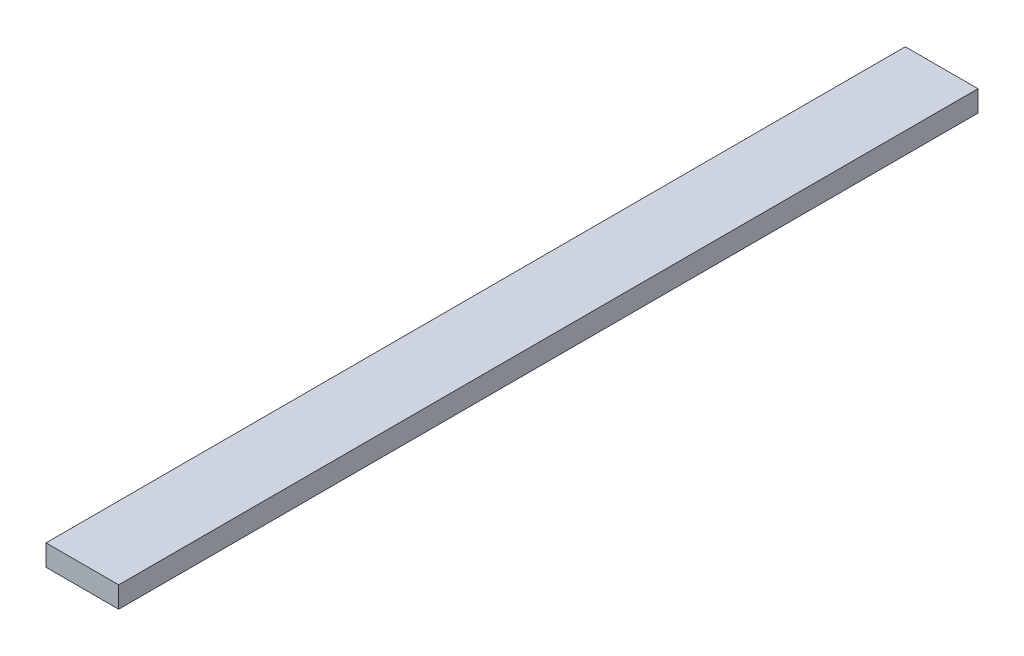
ISO-10303-21;
HEADER;
FILE_DESCRIPTION(('STEP AP214'),'2;1');
FILE_NAME('part.step','',(''),(''),'','','');
FILE_SCHEMA(('AUTOMOTIVE_DESIGN { 1 0 10303 214 1 1 1 1 }'));
ENDSEC;
DATA;
#1=APPLICATION_CONTEXT('core data for automotive mechanical design processes');
#2=APPLICATION_PROTOCOL_DEFINITION('international standard','automotive_design',2000,#1);
#3=PRODUCT_CONTEXT('',#1,'mechanical');
#4=PRODUCT('Part','Part','',(#3));
#5=PRODUCT_RELATED_PRODUCT_CATEGORY('part','',(#4));
#6=PRODUCT_DEFINITION_FORMATION('','',#4);
#7=PRODUCT_DEFINITION_CONTEXT('part definition',#1,'design');
#8=PRODUCT_DEFINITION('design','',#6,#7);
#9=PRODUCT_DEFINITION_SHAPE('','',#8);
#10=(LENGTH_UNIT() NAMED_UNIT(*) SI_UNIT(.MILLI.,.METRE.));
#11=(NAMED_UNIT(*) PLANE_ANGLE_UNIT() SI_UNIT($,.RADIAN.));
#12=(NAMED_UNIT(*) SI_UNIT($,.STERADIAN.) SOLID_ANGLE_UNIT());
#13=UNCERTAINTY_MEASURE_WITH_UNIT(LENGTH_MEASURE(1.E-05),#10,'distance_accuracy_value','');
#14=(GEOMETRIC_REPRESENTATION_CONTEXT(3) GLOBAL_UNCERTAINTY_ASSIGNED_CONTEXT((#13)) GLOBAL_UNIT_ASSIGNED_CONTEXT((#10,
#11,#12)) REPRESENTATION_CONTEXT('',''));
#15=CARTESIAN_POINT('',(0.,0.,0.));
#16=DIRECTION('',(0.,0.,1.));
#17=DIRECTION('',(1.,0.,0.));
#18=AXIS2_PLACEMENT_3D('',#15,#16,#17);
#19=CARTESIAN_POINT('',(-6.14421296296298,2.54,-145.309166666667));
#20=DIRECTION('',(1.,0.,0.));
#21=DIRECTION('',(0.,0.,-1.));
#22=AXIS2_PLACEMENT_3D('',#19,#20,#21);
#23=PLANE('',#22);
#24=DIRECTION('',(0.,0.,1.));
#25=VECTOR('',#24,1.);
#26=CARTESIAN_POINT('',(-6.14421296296298,0.,-145.309166666667));
#27=LINE('',#26,#25);
#28=CARTESIAN_POINT('',(-6.14421296296298,0.,-145.309166666667));
#29=VERTEX_POINT('',#28);
#30=CARTESIAN_POINT('',(-6.14421296296296,0.,19.7908333333333));
#31=VERTEX_POINT('',#30);
#32=EDGE_CURVE('E78',#29,#31,#27,.T.);
#33=ORIENTED_EDGE('',*,*,#32,.T.);
#34=DIRECTION('',(0.,-1.,0.));
#35=VECTOR('',#34,1.);
#36=CARTESIAN_POINT('',(-6.14421296296296,2.54,19.7908333333333));
#37=LINE('',#36,#35);
#38=CARTESIAN_POINT('',(-6.14421296296296,4.064,19.7908333333333));
#39=VERTEX_POINT('',#38);
#40=EDGE_CURVE('E11',#39,#31,#37,.T.);
#41=ORIENTED_EDGE('',*,*,#40,.F.);
#42=DIRECTION('',(0.,0.,1.));
#43=VECTOR('',#42,1.);
#44=CARTESIAN_POINT('',(-6.14421296296296,4.064,19.7908333333333));
#45=LINE('',#44,#43);
#46=CARTESIAN_POINT('',(-6.14421296296296,4.064,-145.309166666667));
#47=VERTEX_POINT('',#46);
#48=EDGE_CURVE('E76',#47,#39,#45,.T.);
#49=ORIENTED_EDGE('',*,*,#48,.F.);
#50=DIRECTION('',(0.,-1.,0.));
#51=VECTOR('',#50,1.);
#52=CARTESIAN_POINT('',(-6.14421296296298,2.54,-145.309166666667));
#53=LINE('',#52,#51);
#54=EDGE_CURVE('E101',#47,#29,#53,.T.);
#55=ORIENTED_EDGE('',*,*,#54,.T.);
#56=EDGE_LOOP('',(#33,#41,#49,#55));
#57=FACE_BOUND('',#56,.T.);
#58=ADVANCED_FACE('F33',(#57),#23,.F.);
#59=CARTESIAN_POINT('',(-6.14421296296296,2.54,19.7908333333333));
#60=DIRECTION('',(0.,0.,-1.));
#61=DIRECTION('',(-1.,0.,0.));
#62=AXIS2_PLACEMENT_3D('',#59,#60,#61);
#63=PLANE('',#62);
#64=DIRECTION('',(1.,0.,0.));
#65=VECTOR('',#64,1.);
#66=CARTESIAN_POINT('',(-6.14421296296296,0.,19.7908333333333));
#67=LINE('',#66,#65);
#68=CARTESIAN_POINT('',(7.82578703703704,0.,19.7908333333333));
#69=VERTEX_POINT('',#68);
#70=EDGE_CURVE('E97',#31,#69,#67,.T.);
#71=ORIENTED_EDGE('',*,*,#70,.T.);
#72=DIRECTION('',(0.,-1.,0.));
#73=VECTOR('',#72,1.);
#74=CARTESIAN_POINT('',(7.82578703703704,2.54,19.7908333333333));
#75=LINE('',#74,#73);
#76=CARTESIAN_POINT('',(7.82578703703702,4.064,19.7908333333333));
#77=VERTEX_POINT('',#76);
#78=EDGE_CURVE('E40',#77,#69,#75,.T.);
#79=ORIENTED_EDGE('',*,*,#78,.F.);
#80=DIRECTION('',(1.,0.,0.));
#81=VECTOR('',#80,1.);
#82=CARTESIAN_POINT('',(-6.14421296296296,4.064,19.7908333333333));
#83=LINE('',#82,#81);
#84=EDGE_CURVE('E81',#39,#77,#83,.T.);
#85=ORIENTED_EDGE('',*,*,#84,.F.);
#86=ORIENTED_EDGE('',*,*,#40,.T.);
#87=EDGE_LOOP('',(#71,#79,#85,#86));
#88=FACE_BOUND('',#87,.T.);
#89=ADVANCED_FACE('F82',(#88),#63,.F.);
#90=CARTESIAN_POINT('',(7.82578703703702,2.54,-145.309166666667));
#91=DIRECTION('',(-1.,0.,0.));
#92=DIRECTION('',(0.,0.,1.));
#93=AXIS2_PLACEMENT_3D('',#90,#91,#92);
#94=PLANE('',#93);
#95=DIRECTION('',(0.,0.,-1.));
#96=VECTOR('',#95,1.);
#97=CARTESIAN_POINT('',(7.82578703703702,0.,-145.309166666667));
#98=LINE('',#97,#96);
#99=CARTESIAN_POINT('',(7.82578703703702,0.,-145.309166666667));
#100=VERTEX_POINT('',#99);
#101=EDGE_CURVE('E55',#69,#100,#98,.T.);
#102=ORIENTED_EDGE('',*,*,#101,.T.);
#103=DIRECTION('',(0.,-1.,0.));
#104=VECTOR('',#103,1.);
#105=CARTESIAN_POINT('',(7.82578703703702,2.54,-145.309166666667));
#106=LINE('',#105,#104);
#107=CARTESIAN_POINT('',(7.82578703703702,4.064,-145.309166666667));
#108=VERTEX_POINT('',#107);
#109=EDGE_CURVE('E103',#108,#100,#106,.T.);
#110=ORIENTED_EDGE('',*,*,#109,.F.);
#111=DIRECTION('',(0.,0.,-1.));
#112=VECTOR('',#111,1.);
#113=CARTESIAN_POINT('',(7.82578703703702,4.064,19.7908333333333));
#114=LINE('',#113,#112);
#115=EDGE_CURVE('E86',#77,#108,#114,.T.);
#116=ORIENTED_EDGE('',*,*,#115,.F.);
#117=ORIENTED_EDGE('',*,*,#78,.T.);
#118=EDGE_LOOP('',(#102,#110,#116,#117));
#119=FACE_BOUND('',#118,.T.);
#120=ADVANCED_FACE('F104',(#119),#94,.F.);
#121=CARTESIAN_POINT('',(-6.14421296296298,2.54,-145.309166666667));
#122=DIRECTION('',(0.,0.,1.));
#123=DIRECTION('',(1.,0.,0.));
#124=AXIS2_PLACEMENT_3D('',#121,#122,#123);
#125=PLANE('',#124);
#126=DIRECTION('',(-1.,0.,0.));
#127=VECTOR('',#126,1.);
#128=CARTESIAN_POINT('',(-6.14421296296298,0.,-145.309166666667));
#129=LINE('',#128,#127);
#130=EDGE_CURVE('E47',#100,#29,#129,.T.);
#131=ORIENTED_EDGE('',*,*,#130,.T.);
#132=ORIENTED_EDGE('',*,*,#54,.F.);
#133=DIRECTION('',(-1.,0.,0.));
#134=VECTOR('',#133,1.);
#135=CARTESIAN_POINT('',(-6.14421296296296,4.064,-145.309166666667));
#136=LINE('',#135,#134);
#137=EDGE_CURVE('E91',#108,#47,#136,.T.);
#138=ORIENTED_EDGE('',*,*,#137,.F.);
#139=ORIENTED_EDGE('',*,*,#109,.T.);
#140=EDGE_LOOP('',(#131,#132,#138,#139));
#141=FACE_BOUND('',#140,.T.);
#142=ADVANCED_FACE('F108',(#141),#125,.F.);
#143=CARTESIAN_POINT('',(0.,0.,0.));
#144=DIRECTION('',(0.,1.,0.));
#145=DIRECTION('',(0.,0.,1.));
#146=AXIS2_PLACEMENT_3D('',#143,#144,#145);
#147=PLANE('',#146);
#148=ORIENTED_EDGE('',*,*,#32,.F.);
#149=ORIENTED_EDGE('',*,*,#130,.F.);
#150=ORIENTED_EDGE('',*,*,#101,.F.);
#151=ORIENTED_EDGE('',*,*,#70,.F.);
#152=EDGE_LOOP('',(#148,#149,#150,#151));
#153=FACE_BOUND('',#152,.T.);
#154=ADVANCED_FACE('F106',(#153),#147,.F.);
#155=CARTESIAN_POINT('',(0.,4.064,0.));
#156=DIRECTION('',(0.,-1.,0.));
#157=DIRECTION('',(0.,0.,-1.));
#158=AXIS2_PLACEMENT_3D('',#155,#156,#157);
#159=PLANE('',#158);
#160=ORIENTED_EDGE('',*,*,#48,.T.);
#161=ORIENTED_EDGE('',*,*,#84,.T.);
#162=ORIENTED_EDGE('',*,*,#115,.T.);
#163=ORIENTED_EDGE('',*,*,#137,.T.);
#164=EDGE_LOOP('',(#160,#161,#162,#163));
#165=FACE_BOUND('',#164,.T.);
#166=ADVANCED_FACE('F89',(#165),#159,.F.);
#167=CLOSED_SHELL('',(#58,#89,#120,#142,#154,#166));
#168=MANIFOLD_SOLID_BREP('B2',#167);
#169=ADVANCED_BREP_SHAPE_REPRESENTATION('',(#18,#168),#14);
#170=SHAPE_DEFINITION_REPRESENTATION(#9,#169);
ENDSEC;
END-ISO-10303-21;
